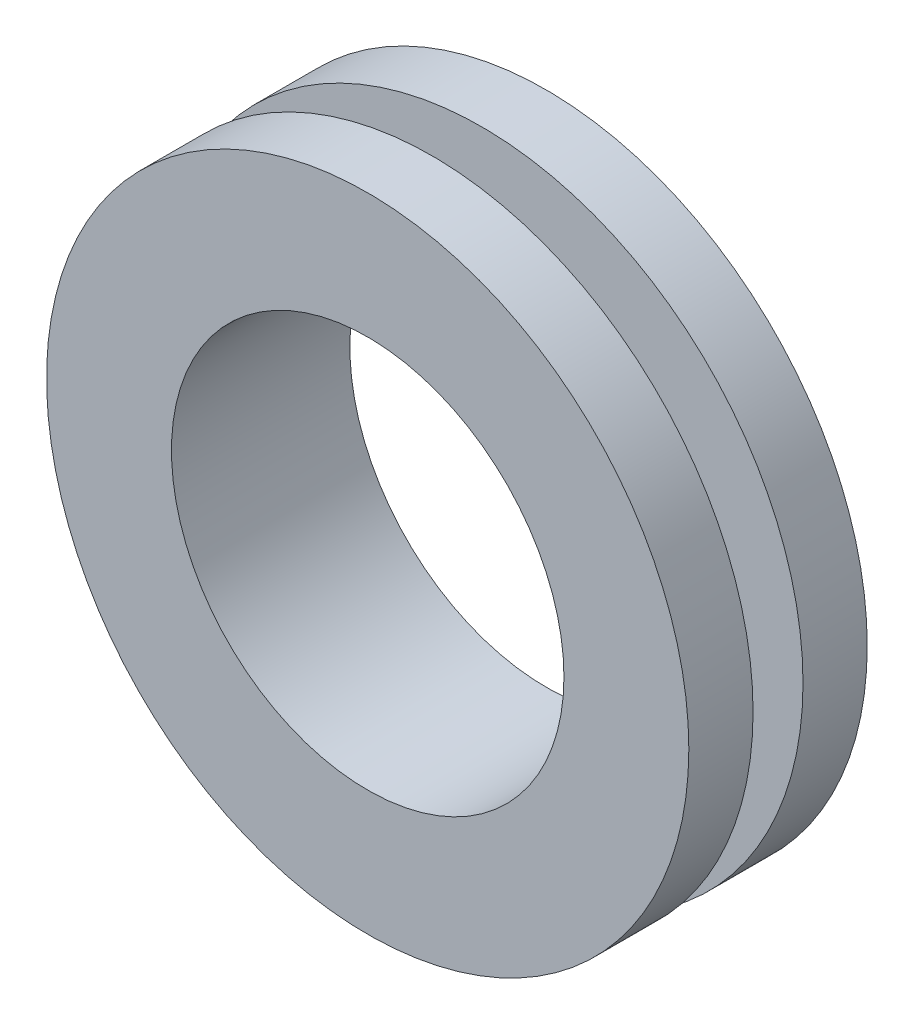
ISO-10303-21;
HEADER;
FILE_DESCRIPTION(('STEP AP214'),'2;1');
FILE_NAME('part.step','',(''),(''),'','','');
FILE_SCHEMA(('AUTOMOTIVE_DESIGN { 1 0 10303 214 1 1 1 1 }'));
ENDSEC;
DATA;
#1=APPLICATION_CONTEXT('core data for automotive mechanical design processes');
#2=APPLICATION_PROTOCOL_DEFINITION('international standard','automotive_design',2000,#1);
#3=PRODUCT_CONTEXT('',#1,'mechanical');
#4=PRODUCT('Part','Part','',(#3));
#5=PRODUCT_RELATED_PRODUCT_CATEGORY('part','',(#4));
#6=PRODUCT_DEFINITION_FORMATION('','',#4);
#7=PRODUCT_DEFINITION_CONTEXT('part definition',#1,'design');
#8=PRODUCT_DEFINITION('design','',#6,#7);
#9=PRODUCT_DEFINITION_SHAPE('','',#8);
#10=(LENGTH_UNIT() NAMED_UNIT(*) SI_UNIT(.MILLI.,.METRE.));
#11=(NAMED_UNIT(*) PLANE_ANGLE_UNIT() SI_UNIT($,.RADIAN.));
#12=(NAMED_UNIT(*) SI_UNIT($,.STERADIAN.) SOLID_ANGLE_UNIT());
#13=UNCERTAINTY_MEASURE_WITH_UNIT(LENGTH_MEASURE(1.E-05),#10,'distance_accuracy_value','');
#14=(GEOMETRIC_REPRESENTATION_CONTEXT(3) GLOBAL_UNCERTAINTY_ASSIGNED_CONTEXT((#13)) GLOBAL_UNIT_ASSIGNED_CONTEXT((#10,
#11,#12)) REPRESENTATION_CONTEXT('',''));
#15=CARTESIAN_POINT('',(0.,0.,0.));
#16=DIRECTION('',(0.,0.,1.));
#17=DIRECTION('',(1.,0.,0.));
#18=AXIS2_PLACEMENT_3D('',#15,#16,#17);
#19=CARTESIAN_POINT('',(0.,0.,9.));
#20=DIRECTION('',(0.,0.,-1.));
#21=DIRECTION('',(-1.,0.,0.));
#22=AXIS2_PLACEMENT_3D('',#19,#20,#21);
#23=CYLINDRICAL_SURFACE('',#22,45.);
#24=CARTESIAN_POINT('',(0.,0.,9.));
#25=DIRECTION('',(0.,0.,1.));
#26=DIRECTION('',(1.,0.,0.));
#27=AXIS2_PLACEMENT_3D('',#24,#25,#26);
#28=CIRCLE('',#27,45.);
#29=CARTESIAN_POINT('',(45.,0.,9.));
#30=VERTEX_POINT('',#29);
#31=EDGE_CURVE('E42',#30,#30,#28,.T.);
#32=ORIENTED_EDGE('',*,*,#31,.F.);
#33=EDGE_LOOP('',(#32));
#34=FACE_BOUND('',#33,.T.);
#35=CARTESIAN_POINT('',(0.,0.,0.));
#36=DIRECTION('',(0.,0.,1.));
#37=DIRECTION('',(1.,0.,0.));
#38=AXIS2_PLACEMENT_3D('',#35,#36,#37);
#39=CIRCLE('',#38,45.);
#40=CARTESIAN_POINT('',(45.,0.,0.));
#41=VERTEX_POINT('',#40);
#42=EDGE_CURVE('E38',#41,#41,#39,.T.);
#43=ORIENTED_EDGE('',*,*,#42,.T.);
#44=EDGE_LOOP('',(#43));
#45=FACE_BOUND('',#44,.T.);
#46=ADVANCED_FACE('F35',(#34,#45),#23,.T.);
#47=CARTESIAN_POINT('',(0.,0.,9.));
#48=DIRECTION('',(0.,0.,1.));
#49=DIRECTION('',(1.,0.,0.));
#50=AXIS2_PLACEMENT_3D('',#47,#48,#49);
#51=PLANE('',#50);
#52=CARTESIAN_POINT('',(0.,0.,9.));
#53=DIRECTION('',(0.,0.,1.));
#54=DIRECTION('',(1.,0.,0.));
#55=AXIS2_PLACEMENT_3D('',#52,#53,#54);
#56=CIRCLE('',#55,32.5);
#57=CARTESIAN_POINT('',(32.5,0.,9.));
#58=VERTEX_POINT('',#57);
#59=EDGE_CURVE('E10',#58,#58,#56,.T.);
#60=ORIENTED_EDGE('',*,*,#59,.F.);
#61=EDGE_LOOP('',(#60));
#62=FACE_BOUND('',#61,.T.);
#63=ORIENTED_EDGE('',*,*,#31,.T.);
#64=EDGE_LOOP('',(#63));
#65=FACE_BOUND('',#64,.T.);
#66=ADVANCED_FACE('F93',(#62,#65),#51,.T.);
#67=CARTESIAN_POINT('',(0.,0.,0.));
#68=DIRECTION('',(0.,0.,1.));
#69=DIRECTION('',(1.,0.,0.));
#70=AXIS2_PLACEMENT_3D('',#67,#68,#69);
#71=PLANE('',#70);
#72=CARTESIAN_POINT('',(0.,0.,0.));
#73=DIRECTION('',(0.,0.,1.));
#74=DIRECTION('',(1.,0.,0.));
#75=AXIS2_PLACEMENT_3D('',#72,#73,#74);
#76=CIRCLE('',#75,27.5);
#77=CARTESIAN_POINT('',(27.5,0.,0.));
#78=VERTEX_POINT('',#77);
#79=EDGE_CURVE('E55',#78,#78,#76,.T.);
#80=ORIENTED_EDGE('',*,*,#79,.T.);
#81=EDGE_LOOP('',(#80));
#82=FACE_BOUND('',#81,.T.);
#83=ORIENTED_EDGE('',*,*,#42,.F.);
#84=EDGE_LOOP('',(#83));
#85=FACE_BOUND('',#84,.T.);
#86=ADVANCED_FACE('F64',(#82,#85),#71,.F.);
#87=CARTESIAN_POINT('',(0.,0.,16.));
#88=DIRECTION('',(0.,0.,-1.));
#89=DIRECTION('',(-1.,0.,0.));
#90=AXIS2_PLACEMENT_3D('',#87,#88,#89);
#91=CYLINDRICAL_SURFACE('',#90,32.5);
#92=CARTESIAN_POINT('',(0.,0.,16.));
#93=DIRECTION('',(0.,0.,1.));
#94=DIRECTION('',(1.,0.,0.));
#95=AXIS2_PLACEMENT_3D('',#92,#93,#94);
#96=CIRCLE('',#95,32.5);
#97=CARTESIAN_POINT('',(32.5,0.,16.));
#98=VERTEX_POINT('',#97);
#99=EDGE_CURVE('E48',#98,#98,#96,.T.);
#100=ORIENTED_EDGE('',*,*,#99,.F.);
#101=EDGE_LOOP('',(#100));
#102=FACE_BOUND('',#101,.T.);
#103=ORIENTED_EDGE('',*,*,#59,.T.);
#104=EDGE_LOOP('',(#103));
#105=FACE_BOUND('',#104,.T.);
#106=ADVANCED_FACE('F83',(#102,#105),#91,.T.);
#107=CARTESIAN_POINT('',(0.,0.,25.));
#108=DIRECTION('',(0.,0.,-1.));
#109=DIRECTION('',(-1.,0.,0.));
#110=AXIS2_PLACEMENT_3D('',#107,#108,#109);
#111=CYLINDRICAL_SURFACE('',#110,45.);
#112=CARTESIAN_POINT('',(0.,0.,25.));
#113=DIRECTION('',(0.,0.,1.));
#114=DIRECTION('',(1.,0.,0.));
#115=AXIS2_PLACEMENT_3D('',#112,#113,#114);
#116=CIRCLE('',#115,45.);
#117=CARTESIAN_POINT('',(45.,0.,25.));
#118=VERTEX_POINT('',#117);
#119=EDGE_CURVE('E51',#118,#118,#116,.T.);
#120=ORIENTED_EDGE('',*,*,#119,.F.);
#121=EDGE_LOOP('',(#120));
#122=FACE_BOUND('',#121,.T.);
#123=CARTESIAN_POINT('',(0.,0.,16.));
#124=DIRECTION('',(0.,0.,1.));
#125=DIRECTION('',(1.,0.,0.));
#126=AXIS2_PLACEMENT_3D('',#123,#124,#125);
#127=CIRCLE('',#126,45.);
#128=CARTESIAN_POINT('',(45.,0.,16.));
#129=VERTEX_POINT('',#128);
#130=EDGE_CURVE('E52',#129,#129,#127,.T.);
#131=ORIENTED_EDGE('',*,*,#130,.T.);
#132=EDGE_LOOP('',(#131));
#133=FACE_BOUND('',#132,.T.);
#134=ADVANCED_FACE('F77',(#122,#133),#111,.T.);
#135=CARTESIAN_POINT('',(0.,0.,25.));
#136=DIRECTION('',(0.,0.,1.));
#137=DIRECTION('',(1.,0.,0.));
#138=AXIS2_PLACEMENT_3D('',#135,#136,#137);
#139=PLANE('',#138);
#140=CARTESIAN_POINT('',(0.,0.,25.));
#141=DIRECTION('',(0.,0.,1.));
#142=DIRECTION('',(1.,0.,0.));
#143=AXIS2_PLACEMENT_3D('',#140,#141,#142);
#144=CIRCLE('',#143,27.5);
#145=CARTESIAN_POINT('',(27.5,0.,25.));
#146=VERTEX_POINT('',#145);
#147=EDGE_CURVE('E58',#146,#146,#144,.T.);
#148=ORIENTED_EDGE('',*,*,#147,.F.);
#149=EDGE_LOOP('',(#148));
#150=FACE_BOUND('',#149,.T.);
#151=ORIENTED_EDGE('',*,*,#119,.T.);
#152=EDGE_LOOP('',(#151));
#153=FACE_BOUND('',#152,.T.);
#154=ADVANCED_FACE('F74',(#150,#153),#139,.T.);
#155=CARTESIAN_POINT('',(0.,0.,16.));
#156=DIRECTION('',(0.,0.,1.));
#157=DIRECTION('',(1.,0.,0.));
#158=AXIS2_PLACEMENT_3D('',#155,#156,#157);
#159=PLANE('',#158);
#160=ORIENTED_EDGE('',*,*,#99,.T.);
#161=EDGE_LOOP('',(#160));
#162=FACE_BOUND('',#161,.T.);
#163=ORIENTED_EDGE('',*,*,#130,.F.);
#164=EDGE_LOOP('',(#163));
#165=FACE_BOUND('',#164,.T.);
#166=ADVANCED_FACE('F70',(#162,#165),#159,.F.);
#167=CARTESIAN_POINT('',(0.,0.,0.));
#168=DIRECTION('',(0.,0.,1.));
#169=DIRECTION('',(1.,0.,0.));
#170=AXIS2_PLACEMENT_3D('',#167,#168,#169);
#171=CYLINDRICAL_SURFACE('',#170,27.5);
#172=ORIENTED_EDGE('',*,*,#79,.F.);
#173=EDGE_LOOP('',(#172));
#174=FACE_BOUND('',#173,.T.);
#175=ORIENTED_EDGE('',*,*,#147,.T.);
#176=EDGE_LOOP('',(#175));
#177=FACE_BOUND('',#176,.T.);
#178=ADVANCED_FACE('F67',(#174,#177),#171,.F.);
#179=CLOSED_SHELL('',(#46,#66,#86,#106,#134,#154,#166,#178));
#180=MANIFOLD_SOLID_BREP('B2',#179);
#181=ADVANCED_BREP_SHAPE_REPRESENTATION('',(#18,#180),#14);
#182=SHAPE_DEFINITION_REPRESENTATION(#9,#181);
ENDSEC;
END-ISO-10303-21;
